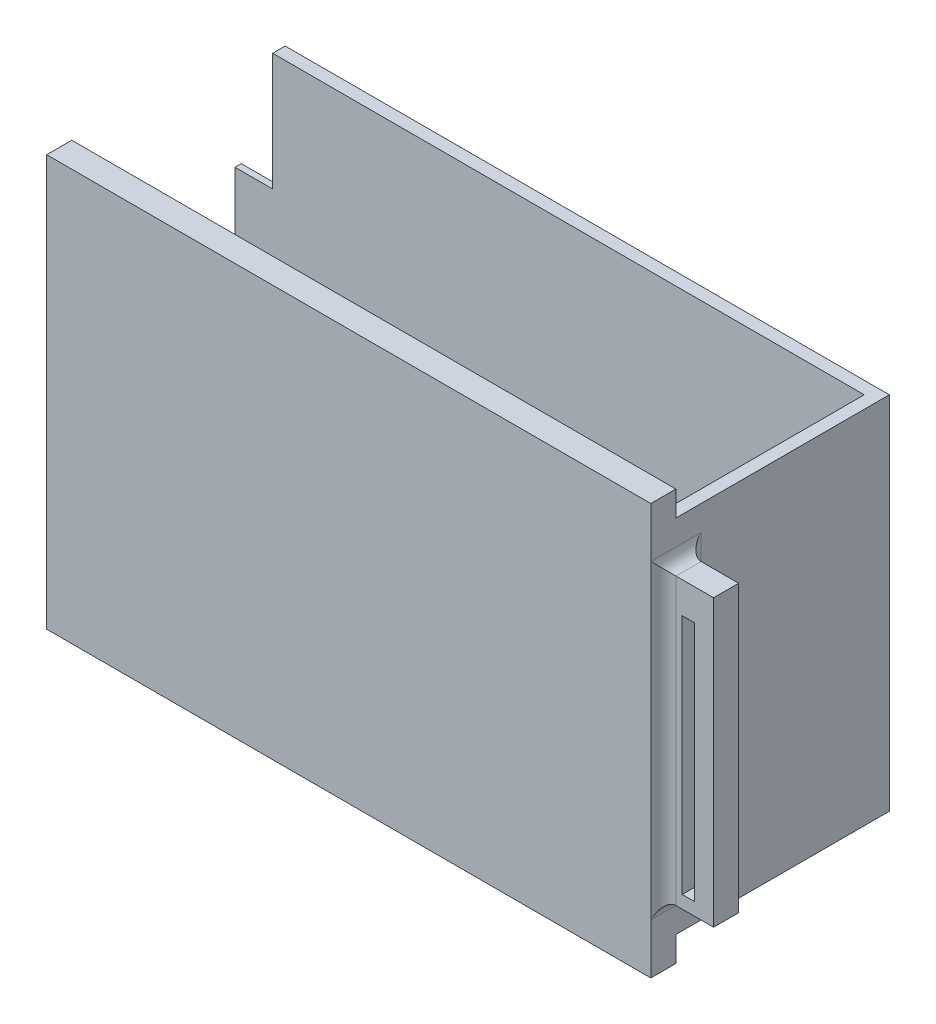
ISO-10303-21;
HEADER;
FILE_DESCRIPTION(('STEP AP214'),'2;1');
FILE_NAME('part.step','',(''),(''),'','','');
FILE_SCHEMA(('AUTOMOTIVE_DESIGN { 1 0 10303 214 1 1 1 1 }'));
ENDSEC;
DATA;
#1=APPLICATION_CONTEXT('core data for automotive mechanical design processes');
#2=APPLICATION_PROTOCOL_DEFINITION('international standard','automotive_design',2000,#1);
#3=PRODUCT_CONTEXT('',#1,'mechanical');
#4=PRODUCT('Part','Part','',(#3));
#5=PRODUCT_RELATED_PRODUCT_CATEGORY('part','',(#4));
#6=PRODUCT_DEFINITION_FORMATION('','',#4);
#7=PRODUCT_DEFINITION_CONTEXT('part definition',#1,'design');
#8=PRODUCT_DEFINITION('design','',#6,#7);
#9=PRODUCT_DEFINITION_SHAPE('','',#8);
#10=(LENGTH_UNIT() NAMED_UNIT(*) SI_UNIT(.MILLI.,.METRE.));
#11=(NAMED_UNIT(*) PLANE_ANGLE_UNIT() SI_UNIT($,.RADIAN.));
#12=(NAMED_UNIT(*) SI_UNIT($,.STERADIAN.) SOLID_ANGLE_UNIT());
#13=UNCERTAINTY_MEASURE_WITH_UNIT(LENGTH_MEASURE(1.E-05),#10,'distance_accuracy_value','');
#14=(GEOMETRIC_REPRESENTATION_CONTEXT(3) GLOBAL_UNCERTAINTY_ASSIGNED_CONTEXT((#13)) GLOBAL_UNIT_ASSIGNED_CONTEXT((#10,
#11,#12)) REPRESENTATION_CONTEXT('',''));
#15=CARTESIAN_POINT('',(0.,0.,0.));
#16=DIRECTION('',(0.,0.,1.));
#17=DIRECTION('',(1.,0.,0.));
#18=AXIS2_PLACEMENT_3D('',#15,#16,#17);
#19=CARTESIAN_POINT('',(1.,761.955360665247,1239.52069633304));
#20=DIRECTION('',(0.,0.,-1.));
#21=DIRECTION('',(-1.,0.,0.));
#22=AXIS2_PLACEMENT_3D('',#19,#20,#21);
#23=CYLINDRICAL_SURFACE('',#22,1.);
#24=DIRECTION('',(0.,0.,-1.));
#25=VECTOR('',#24,1.);
#26=CARTESIAN_POINT('',(1.,762.955360665247,1239.52069633304));
#27=LINE('',#26,#25);
#28=CARTESIAN_POINT('',(1.,762.955360665247,1239.52069633304));
#29=VERTEX_POINT('',#28);
#30=CARTESIAN_POINT('',(1.,762.955360665247,1237.52069633304));
#31=VERTEX_POINT('',#30);
#32=EDGE_CURVE('E388',#29,#31,#27,.T.);
#33=ORIENTED_EDGE('',*,*,#32,.F.);
#34=CARTESIAN_POINT('',(1.,761.955360665247,1240.52069633304));
#35=DIRECTION('',(0.,-0.707106781186547,-0.707106781186547));
#36=DIRECTION('',(0.,-0.707106781186547,0.707106781186547));
#37=AXIS2_PLACEMENT_3D('',#34,#35,#36);
#38=ELLIPSE('',#37,1.41421356237309,1.);
#39=CARTESIAN_POINT('',(0.,761.955360665247,1240.52069633304));
#40=VERTEX_POINT('',#39);
#41=EDGE_CURVE('E44',#29,#40,#38,.F.);
#42=ORIENTED_EDGE('',*,*,#41,.T.);
#43=DIRECTION('',(0.,0.,-1.));
#44=VECTOR('',#43,1.);
#45=CARTESIAN_POINT('',(0.,761.955360665247,0.));
#46=LINE('',#45,#44);
#47=CARTESIAN_POINT('',(0.,761.955360665247,1236.52069633304));
#48=VERTEX_POINT('',#47);
#49=EDGE_CURVE('E391',#48,#40,#46,.F.);
#50=ORIENTED_EDGE('',*,*,#49,.F.);
#51=CARTESIAN_POINT('',(1.,761.955360665247,1236.52069633304));
#52=DIRECTION('',(0.,0.707106781186547,-0.707106781186547));
#53=DIRECTION('',(0.,0.707106781186547,0.707106781186547));
#54=AXIS2_PLACEMENT_3D('',#51,#52,#53);
#55=ELLIPSE('',#54,1.41421356237309,1.);
#56=EDGE_CURVE('E11',#48,#31,#55,.T.);
#57=ORIENTED_EDGE('',*,*,#56,.T.);
#58=EDGE_LOOP('',(#33,#42,#50,#57));
#59=FACE_BOUND('',#58,.T.);
#60=ADVANCED_FACE('F37',(#59),#23,.F.);
#61=CARTESIAN_POINT('',(1.,786.685360665247,0.));
#62=DIRECTION('',(0.,0.,-1.));
#63=DIRECTION('',(-1.,0.,0.));
#64=AXIS2_PLACEMENT_3D('',#61,#62,#63);
#65=CYLINDRICAL_SURFACE('',#64,1.);
#66=DIRECTION('',(0.,0.,-1.));
#67=VECTOR('',#66,1.);
#68=CARTESIAN_POINT('',(0.,786.685360665247,0.));
#69=LINE('',#68,#67);
#70=CARTESIAN_POINT('',(0.,786.685360665247,1240.52069633304));
#71=VERTEX_POINT('',#70);
#72=CARTESIAN_POINT('',(0.,786.685360665247,1236.52069633304));
#73=VERTEX_POINT('',#72);
#74=EDGE_CURVE('E378',#71,#73,#69,.T.);
#75=ORIENTED_EDGE('',*,*,#74,.F.);
#76=CARTESIAN_POINT('',(1.,786.685360665247,1240.52069633304));
#77=DIRECTION('',(0.,-0.707106781186547,0.707106781186547));
#78=DIRECTION('',(0.,-0.707106781186547,-0.707106781186547));
#79=AXIS2_PLACEMENT_3D('',#76,#77,#78);
#80=ELLIPSE('',#79,1.41421356237309,1.);
#81=CARTESIAN_POINT('',(1.,785.685360665247,1239.52069633304));
#82=VERTEX_POINT('',#81);
#83=EDGE_CURVE('E383',#71,#82,#80,.T.);
#84=ORIENTED_EDGE('',*,*,#83,.T.);
#85=DIRECTION('',(0.,0.,-1.));
#86=VECTOR('',#85,1.);
#87=CARTESIAN_POINT('',(1.,785.685360665247,1239.52069633304));
#88=LINE('',#87,#86);
#89=CARTESIAN_POINT('',(1.,785.685360665247,1237.52069633304));
#90=VERTEX_POINT('',#89);
#91=EDGE_CURVE('E380',#90,#82,#88,.F.);
#92=ORIENTED_EDGE('',*,*,#91,.F.);
#93=CARTESIAN_POINT('',(1.,786.685360665247,1236.52069633304));
#94=DIRECTION('',(0.,0.707106781186547,0.707106781186547));
#95=DIRECTION('',(0.,0.707106781186547,-0.707106781186547));
#96=AXIS2_PLACEMENT_3D('',#93,#94,#95);
#97=ELLIPSE('',#96,1.41421356237309,1.);
#98=EDGE_CURVE('E385',#90,#73,#97,.F.);
#99=ORIENTED_EDGE('',*,*,#98,.T.);
#100=EDGE_LOOP('',(#75,#84,#92,#99));
#101=FACE_BOUND('',#100,.T.);
#102=ADVANCED_FACE('F452',(#101),#65,.F.);
#103=CARTESIAN_POINT('',(1.,785.685360665247,1236.52069633304));
#104=DIRECTION('',(0.,1.,0.));
#105=DIRECTION('',(0.,0.,1.));
#106=AXIS2_PLACEMENT_3D('',#103,#104,#105);
#107=CYLINDRICAL_SURFACE('',#106,1.);
#108=DIRECTION('',(0.,1.,0.));
#109=VECTOR('',#108,1.);
#110=CARTESIAN_POINT('',(1.,785.685360665247,1237.52069633304));
#111=LINE('',#110,#109);
#112=EDGE_CURVE('E374',#31,#90,#111,.T.);
#113=ORIENTED_EDGE('',*,*,#112,.F.);
#114=ORIENTED_EDGE('',*,*,#56,.F.);
#115=DIRECTION('',(0.,1.,0.));
#116=VECTOR('',#115,1.);
#117=CARTESIAN_POINT('',(0.,0.,1236.52069633304));
#118=LINE('',#117,#116);
#119=EDGE_CURVE('E51',#73,#48,#118,.F.);
#120=ORIENTED_EDGE('',*,*,#119,.F.);
#121=ORIENTED_EDGE('',*,*,#98,.F.);
#122=EDGE_LOOP('',(#113,#114,#120,#121));
#123=FACE_BOUND('',#122,.T.);
#124=ADVANCED_FACE('F457',(#123),#107,.F.);
#125=CARTESIAN_POINT('',(1.,785.685360665247,1240.52069633304));
#126=DIRECTION('',(0.,-1.,0.));
#127=DIRECTION('',(0.,0.,-1.));
#128=AXIS2_PLACEMENT_3D('',#125,#126,#127);
#129=CYLINDRICAL_SURFACE('',#128,1.);
#130=DIRECTION('',(0.,-1.,0.));
#131=VECTOR('',#130,1.);
#132=CARTESIAN_POINT('',(1.,785.685360665247,1239.52069633304));
#133=LINE('',#132,#131);
#134=EDGE_CURVE('E357',#82,#29,#133,.T.);
#135=ORIENTED_EDGE('',*,*,#134,.F.);
#136=ORIENTED_EDGE('',*,*,#83,.F.);
#137=DIRECTION('',(0.,-1.,0.));
#138=VECTOR('',#137,1.);
#139=CARTESIAN_POINT('',(0.,790.685360665247,1240.52069633304));
#140=LINE('',#139,#138);
#141=EDGE_CURVE('E59',#71,#40,#140,.T.);
#142=ORIENTED_EDGE('',*,*,#141,.T.);
#143=ORIENTED_EDGE('',*,*,#41,.F.);
#144=EDGE_LOOP('',(#135,#136,#142,#143));
#145=FACE_BOUND('',#144,.T.);
#146=ADVANCED_FACE('F462',(#145),#129,.F.);
#147=CARTESIAN_POINT('',(0.,0.,0.));
#148=DIRECTION('',(1.,0.,0.));
#149=DIRECTION('',(0.,0.,-1.));
#150=AXIS2_PLACEMENT_3D('',#147,#148,#149);
#151=PLANE('',#150);
#152=ORIENTED_EDGE('',*,*,#119,.T.);
#153=ORIENTED_EDGE('',*,*,#49,.T.);
#154=CARTESIAN_POINT('',(0.,757.955360665247,1240.52069633304));
#155=VERTEX_POINT('',#154);
#156=EDGE_CURVE('E308',#40,#155,#140,.T.);
#157=ORIENTED_EDGE('',*,*,#156,.T.);
#158=DIRECTION('',(0.,0.,-1.));
#159=VECTOR('',#158,1.);
#160=CARTESIAN_POINT('',(0.,757.955360665247,1240.52069633304));
#161=LINE('',#160,#159);
#162=CARTESIAN_POINT('',(0.,757.955360665247,1238.52069633304));
#163=VERTEX_POINT('',#162);
#164=EDGE_CURVE('E335',#155,#163,#161,.T.);
#165=ORIENTED_EDGE('',*,*,#164,.T.);
#166=DIRECTION('',(0.,1.,-2.22044604925031E-13));
#167=VECTOR('',#166,1.);
#168=CARTESIAN_POINT('',(0.,759.955360665247,1238.52069633304));
#169=LINE('',#168,#167);
#170=CARTESIAN_POINT('',(0.,759.955360665247,1238.52069633304));
#171=VERTEX_POINT('',#170);
#172=EDGE_CURVE('E338',#163,#171,#169,.T.);
#173=ORIENTED_EDGE('',*,*,#172,.T.);
#174=DIRECTION('',(0.,0.,-1.));
#175=VECTOR('',#174,1.);
#176=CARTESIAN_POINT('',(0.,759.955360665247,1238.52069633304));
#177=LINE('',#176,#175);
#178=CARTESIAN_POINT('',(0.,759.955360665247,1221.52069633304));
#179=VERTEX_POINT('',#178);
#180=EDGE_CURVE('E341',#171,#179,#177,.T.);
#181=ORIENTED_EDGE('',*,*,#180,.T.);
#182=DIRECTION('',(0.,1.,0.));
#183=VECTOR('',#182,1.);
#184=CARTESIAN_POINT('',(0.,788.685360665247,1221.52069633304));
#185=LINE('',#184,#183);
#186=CARTESIAN_POINT('',(0.,788.685360665247,1221.52069633304));
#187=VERTEX_POINT('',#186);
#188=EDGE_CURVE('E344',#179,#187,#185,.T.);
#189=ORIENTED_EDGE('',*,*,#188,.T.);
#190=DIRECTION('',(0.,0.,1.));
#191=VECTOR('',#190,1.);
#192=CARTESIAN_POINT('',(0.,788.685360665247,1238.52069633304));
#193=LINE('',#192,#191);
#194=CARTESIAN_POINT('',(0.,788.685360665247,1238.52069633304));
#195=VERTEX_POINT('',#194);
#196=EDGE_CURVE('E347',#187,#195,#193,.T.);
#197=ORIENTED_EDGE('',*,*,#196,.T.);
#198=DIRECTION('',(0.,1.,-3.33066907387547E-13));
#199=VECTOR('',#198,1.);
#200=CARTESIAN_POINT('',(0.,790.685360665247,1238.52069633304));
#201=LINE('',#200,#199);
#202=CARTESIAN_POINT('',(0.,790.685360665247,1238.52069633304));
#203=VERTEX_POINT('',#202);
#204=EDGE_CURVE('E350',#195,#203,#201,.T.);
#205=ORIENTED_EDGE('',*,*,#204,.T.);
#206=DIRECTION('',(0.,0.,1.));
#207=VECTOR('',#206,1.);
#208=CARTESIAN_POINT('',(0.,790.685360665247,1240.52069633304));
#209=LINE('',#208,#207);
#210=CARTESIAN_POINT('',(0.,790.685360665247,1240.52069633304));
#211=VERTEX_POINT('',#210);
#212=EDGE_CURVE('E315',#203,#211,#209,.T.);
#213=ORIENTED_EDGE('',*,*,#212,.T.);
#214=EDGE_CURVE('E332',#211,#71,#140,.T.);
#215=ORIENTED_EDGE('',*,*,#214,.T.);
#216=ORIENTED_EDGE('',*,*,#74,.T.);
#217=EDGE_LOOP('',(#152,#153,#157,#165,#173,#181,#189,#197,#205,#213,#215,#216));
#218=FACE_BOUND('',#217,.T.);
#219=ADVANCED_FACE('F397',(#218),#151,.T.);
#220=CARTESIAN_POINT('',(-48.12,0.,0.));
#221=DIRECTION('',(1.,0.,0.));
#222=DIRECTION('',(0.,0.,-1.));
#223=AXIS2_PLACEMENT_3D('',#220,#221,#222);
#224=PLANE('',#223);
#225=DIRECTION('',(0.,0.,1.));
#226=VECTOR('',#225,1.);
#227=CARTESIAN_POINT('',(-48.12,769.320360665247,1222.52069633304));
#228=LINE('',#227,#226);
#229=CARTESIAN_POINT('',(-48.12,769.320360665247,1222.02069633304));
#230=VERTEX_POINT('',#229);
#231=CARTESIAN_POINT('',(-48.12,769.320360665247,1222.52069633304));
#232=VERTEX_POINT('',#231);
#233=EDGE_CURVE('E265',#230,#232,#228,.T.);
#234=ORIENTED_EDGE('',*,*,#233,.F.);
#235=DIRECTION('',(0.,-1.,0.));
#236=VECTOR('',#235,1.);
#237=CARTESIAN_POINT('',(-48.12,779.320360665247,1222.02069633304));
#238=LINE('',#237,#236);
#239=CARTESIAN_POINT('',(-48.12,779.320360665247,1222.02069633304));
#240=VERTEX_POINT('',#239);
#241=EDGE_CURVE('E274',#240,#230,#238,.T.);
#242=ORIENTED_EDGE('',*,*,#241,.F.);
#243=DIRECTION('',(0.,0.,-1.));
#244=VECTOR('',#243,1.);
#245=CARTESIAN_POINT('',(-48.12,779.320360665247,1222.52069633304));
#246=LINE('',#245,#244);
#247=CARTESIAN_POINT('',(-48.12,779.320360665247,1222.52069633304));
#248=VERTEX_POINT('',#247);
#249=EDGE_CURVE('E260',#248,#240,#246,.T.);
#250=ORIENTED_EDGE('',*,*,#249,.F.);
#251=DIRECTION('',(0.,-1.,0.));
#252=VECTOR('',#251,1.);
#253=CARTESIAN_POINT('',(-48.12,788.685360665247,1222.52069633304));
#254=LINE('',#253,#252);
#255=CARTESIAN_POINT('',(-48.12,788.685360665247,1222.52069633304));
#256=VERTEX_POINT('',#255);
#257=EDGE_CURVE('E295',#256,#248,#254,.T.);
#258=ORIENTED_EDGE('',*,*,#257,.F.);
#259=DIRECTION('',(0.,0.,1.));
#260=VECTOR('',#259,1.);
#261=CARTESIAN_POINT('',(-48.12,788.685360665247,1238.52069633304));
#262=LINE('',#261,#260);
#263=CARTESIAN_POINT('',(-48.12,788.685360665247,1221.52069633304));
#264=VERTEX_POINT('',#263);
#265=EDGE_CURVE('E325',#264,#256,#262,.T.);
#266=ORIENTED_EDGE('',*,*,#265,.F.);
#267=DIRECTION('',(0.,1.,0.));
#268=VECTOR('',#267,1.);
#269=CARTESIAN_POINT('',(-48.12,788.685360665247,1221.52069633304));
#270=LINE('',#269,#268);
#271=CARTESIAN_POINT('',(-48.12,759.955360665247,1221.52069633304));
#272=VERTEX_POINT('',#271);
#273=EDGE_CURVE('E322',#272,#264,#270,.T.);
#274=ORIENTED_EDGE('',*,*,#273,.F.);
#275=DIRECTION('',(0.,0.,-1.));
#276=VECTOR('',#275,1.);
#277=CARTESIAN_POINT('',(-48.12,759.955360665247,1238.52069633304));
#278=LINE('',#277,#276);
#279=CARTESIAN_POINT('',(-48.12,759.955360665247,1222.52069633304));
#280=VERTEX_POINT('',#279);
#281=EDGE_CURVE('E320',#280,#272,#278,.T.);
#282=ORIENTED_EDGE('',*,*,#281,.F.);
#283=EDGE_CURVE('E290',#232,#280,#254,.T.);
#284=ORIENTED_EDGE('',*,*,#283,.F.);
#285=EDGE_LOOP('',(#234,#242,#250,#258,#266,#274,#282,#284));
#286=FACE_BOUND('',#285,.T.);
#287=ADVANCED_FACE('F439',(#286),#224,.F.);
#288=CARTESIAN_POINT('',(-48.12,790.685360665247,1240.52069633304));
#289=DIRECTION('',(0.,0.,1.));
#290=DIRECTION('',(1.,0.,0.));
#291=AXIS2_PLACEMENT_3D('',#288,#289,#290);
#292=PLANE('',#291);
#293=ORIENTED_EDGE('',*,*,#214,.F.);
#294=DIRECTION('',(1.,0.,0.));
#295=VECTOR('',#294,1.);
#296=CARTESIAN_POINT('',(-48.12,790.685360665247,1240.52069633304));
#297=LINE('',#296,#295);
#298=CARTESIAN_POINT('',(-48.12,790.685360665247,1240.52069633304));
#299=VERTEX_POINT('',#298);
#300=EDGE_CURVE('E355',#299,#211,#297,.T.);
#301=ORIENTED_EDGE('',*,*,#300,.F.);
#302=DIRECTION('',(0.,-1.,0.));
#303=VECTOR('',#302,1.);
#304=CARTESIAN_POINT('',(-48.12,790.685360665247,1240.52069633304));
#305=LINE('',#304,#303);
#306=CARTESIAN_POINT('',(-48.12,757.955360665247,1240.52069633304));
#307=VERTEX_POINT('',#306);
#308=EDGE_CURVE('E311',#299,#307,#305,.T.);
#309=ORIENTED_EDGE('',*,*,#308,.T.);
#310=DIRECTION('',(1.,0.,0.));
#311=VECTOR('',#310,1.);
#312=CARTESIAN_POINT('',(-48.12,757.955360665247,1240.52069633304));
#313=LINE('',#312,#311);
#314=EDGE_CURVE('E331',#307,#155,#313,.T.);
#315=ORIENTED_EDGE('',*,*,#314,.T.);
#316=ORIENTED_EDGE('',*,*,#156,.F.);
#317=ORIENTED_EDGE('',*,*,#141,.F.);
#318=EDGE_LOOP('',(#293,#301,#309,#315,#316,#317));
#319=FACE_BOUND('',#318,.T.);
#320=ADVANCED_FACE('F400',(#319),#292,.T.);
#321=CARTESIAN_POINT('',(-48.12,790.685360665247,1240.52069633304));
#322=DIRECTION('',(0.,1.,0.));
#323=DIRECTION('',(0.,0.,1.));
#324=AXIS2_PLACEMENT_3D('',#321,#322,#323);
#325=PLANE('',#324);
#326=ORIENTED_EDGE('',*,*,#212,.F.);
#327=DIRECTION('',(1.,0.,0.));
#328=VECTOR('',#327,1.);
#329=CARTESIAN_POINT('',(-48.12,790.685360665247,1238.52069633304));
#330=LINE('',#329,#328);
#331=CARTESIAN_POINT('',(-48.12,790.685360665247,1238.52069633304));
#332=VERTEX_POINT('',#331);
#333=EDGE_CURVE('E358',#332,#203,#330,.T.);
#334=ORIENTED_EDGE('',*,*,#333,.F.);
#335=DIRECTION('',(0.,0.,1.));
#336=VECTOR('',#335,1.);
#337=CARTESIAN_POINT('',(-48.12,790.685360665247,1240.52069633304));
#338=LINE('',#337,#336);
#339=EDGE_CURVE('E328',#332,#299,#338,.T.);
#340=ORIENTED_EDGE('',*,*,#339,.T.);
#341=ORIENTED_EDGE('',*,*,#300,.T.);
#342=EDGE_LOOP('',(#326,#334,#340,#341));
#343=FACE_BOUND('',#342,.T.);
#344=ADVANCED_FACE('F433',(#343),#325,.T.);
#345=CARTESIAN_POINT('',(-48.12,790.685360665247,1238.52069633304));
#346=DIRECTION('',(0.,-3.33066907387547E-13,-1.));
#347=DIRECTION('',(0.,1.,-3.33066907387547E-13));
#348=AXIS2_PLACEMENT_3D('',#345,#346,#347);
#349=PLANE('',#348);
#350=ORIENTED_EDGE('',*,*,#204,.F.);
#351=DIRECTION('',(1.,0.,0.));
#352=VECTOR('',#351,1.);
#353=CARTESIAN_POINT('',(-48.12,788.685360665247,1238.52069633304));
#354=LINE('',#353,#352);
#355=CARTESIAN_POINT('',(-0.999999999999994,788.685360665247,1238.52069633304));
#356=VERTEX_POINT('',#355);
#357=EDGE_CURVE('E360',#356,#195,#354,.T.);
#358=ORIENTED_EDGE('',*,*,#357,.F.);
#359=DIRECTION('',(0.,1.,0.));
#360=VECTOR('',#359,1.);
#361=CARTESIAN_POINT('',(-0.999999999999994,788.685360665247,1238.52069633304));
#362=LINE('',#361,#360);
#363=CARTESIAN_POINT('',(-0.999999999999994,759.955360665247,1238.52069633304));
#364=VERTEX_POINT('',#363);
#365=EDGE_CURVE('E298',#364,#356,#362,.T.);
#366=ORIENTED_EDGE('',*,*,#365,.F.);
#367=DIRECTION('',(1.,0.,0.));
#368=VECTOR('',#367,1.);
#369=CARTESIAN_POINT('',(-48.12,759.955360665247,1238.52069633304));
#370=LINE('',#369,#368);
#371=EDGE_CURVE('E366',#364,#171,#370,.T.);
#372=ORIENTED_EDGE('',*,*,#371,.T.);
#373=ORIENTED_EDGE('',*,*,#172,.F.);
#374=DIRECTION('',(1.,0.,0.));
#375=VECTOR('',#374,1.);
#376=CARTESIAN_POINT('',(-48.12,757.955360665247,1238.52069633304));
#377=LINE('',#376,#375);
#378=CARTESIAN_POINT('',(-48.12,757.955360665247,1238.52069633304));
#379=VERTEX_POINT('',#378);
#380=EDGE_CURVE('E368',#379,#163,#377,.T.);
#381=ORIENTED_EDGE('',*,*,#380,.F.);
#382=DIRECTION('',(0.,1.,-2.22044604925031E-13));
#383=VECTOR('',#382,1.);
#384=CARTESIAN_POINT('',(-48.12,759.955360665247,1238.52069633304));
#385=LINE('',#384,#383);
#386=EDGE_CURVE('E318',#379,#332,#385,.T.);
#387=ORIENTED_EDGE('',*,*,#386,.T.);
#388=ORIENTED_EDGE('',*,*,#333,.T.);
#389=EDGE_LOOP('',(#350,#358,#366,#372,#373,#381,#387,#388));
#390=FACE_BOUND('',#389,.T.);
#391=ADVANCED_FACE('F410',(#390),#349,.T.);
#392=CARTESIAN_POINT('',(-48.12,788.685360665247,1238.52069633304));
#393=DIRECTION('',(0.,1.,0.));
#394=DIRECTION('',(0.,0.,1.));
#395=AXIS2_PLACEMENT_3D('',#392,#393,#394);
#396=PLANE('',#395);
#397=DIRECTION('',(-1.,0.,0.));
#398=VECTOR('',#397,1.);
#399=CARTESIAN_POINT('',(-0.999999999999994,788.685360665247,1222.52069633304));
#400=LINE('',#399,#398);
#401=CARTESIAN_POINT('',(-0.999999999999994,788.685360665247,1222.52069633304));
#402=VERTEX_POINT('',#401);
#403=EDGE_CURVE('E306',#402,#256,#400,.T.);
#404=ORIENTED_EDGE('',*,*,#403,.F.);
#405=DIRECTION('',(0.,0.,-1.));
#406=VECTOR('',#405,1.);
#407=CARTESIAN_POINT('',(-0.999999999999994,788.685360665247,1222.52069633304));
#408=LINE('',#407,#406);
#409=EDGE_CURVE('E300',#356,#402,#408,.T.);
#410=ORIENTED_EDGE('',*,*,#409,.F.);
#411=ORIENTED_EDGE('',*,*,#357,.T.);
#412=ORIENTED_EDGE('',*,*,#196,.F.);
#413=DIRECTION('',(1.,0.,0.));
#414=VECTOR('',#413,1.);
#415=CARTESIAN_POINT('',(-48.12,788.685360665247,1221.52069633304));
#416=LINE('',#415,#414);
#417=EDGE_CURVE('E362',#264,#187,#416,.T.);
#418=ORIENTED_EDGE('',*,*,#417,.F.);
#419=ORIENTED_EDGE('',*,*,#265,.T.);
#420=EDGE_LOOP('',(#404,#410,#411,#412,#418,#419));
#421=FACE_BOUND('',#420,.T.);
#422=ADVANCED_FACE('F427',(#421),#396,.T.);
#423=CARTESIAN_POINT('',(-48.12,788.685360665247,1221.52069633304));
#424=DIRECTION('',(0.,0.,-1.));
#425=DIRECTION('',(-1.,0.,0.));
#426=AXIS2_PLACEMENT_3D('',#423,#424,#425);
#427=PLANE('',#426);
#428=ORIENTED_EDGE('',*,*,#188,.F.);
#429=DIRECTION('',(1.,0.,0.));
#430=VECTOR('',#429,1.);
#431=CARTESIAN_POINT('',(-48.12,759.955360665247,1221.52069633304));
#432=LINE('',#431,#430);
#433=EDGE_CURVE('E364',#272,#179,#432,.T.);
#434=ORIENTED_EDGE('',*,*,#433,.F.);
#435=ORIENTED_EDGE('',*,*,#273,.T.);
#436=ORIENTED_EDGE('',*,*,#417,.T.);
#437=EDGE_LOOP('',(#428,#434,#435,#436));
#438=FACE_BOUND('',#437,.T.);
#439=ADVANCED_FACE('F422',(#438),#427,.T.);
#440=CARTESIAN_POINT('',(-48.12,759.955360665247,1238.52069633304));
#441=DIRECTION('',(0.,-1.,0.));
#442=DIRECTION('',(0.,0.,-1.));
#443=AXIS2_PLACEMENT_3D('',#440,#441,#442);
#444=PLANE('',#443);
#445=DIRECTION('',(-1.,0.,0.));
#446=VECTOR('',#445,1.);
#447=CARTESIAN_POINT('',(-0.999999999999994,759.955360665247,1222.52069633304));
#448=LINE('',#447,#446);
#449=CARTESIAN_POINT('',(-0.999999999999994,759.955360665247,1222.52069633304));
#450=VERTEX_POINT('',#449);
#451=EDGE_CURVE('E303',#450,#280,#448,.T.);
#452=ORIENTED_EDGE('',*,*,#451,.T.);
#453=ORIENTED_EDGE('',*,*,#281,.T.);
#454=ORIENTED_EDGE('',*,*,#433,.T.);
#455=ORIENTED_EDGE('',*,*,#180,.F.);
#456=ORIENTED_EDGE('',*,*,#371,.F.);
#457=DIRECTION('',(0.,0.,1.));
#458=VECTOR('',#457,1.);
#459=CARTESIAN_POINT('',(-0.999999999999994,759.955360665247,1222.52069633304));
#460=LINE('',#459,#458);
#461=EDGE_CURVE('E294',#450,#364,#460,.T.);
#462=ORIENTED_EDGE('',*,*,#461,.F.);
#463=EDGE_LOOP('',(#452,#453,#454,#455,#456,#462));
#464=FACE_BOUND('',#463,.T.);
#465=ADVANCED_FACE('F416',(#464),#444,.T.);
#466=CARTESIAN_POINT('',(-48.12,757.955360665247,1240.52069633304));
#467=DIRECTION('',(0.,-1.,0.));
#468=DIRECTION('',(0.,0.,-1.));
#469=AXIS2_PLACEMENT_3D('',#466,#467,#468);
#470=PLANE('',#469);
#471=ORIENTED_EDGE('',*,*,#164,.F.);
#472=ORIENTED_EDGE('',*,*,#314,.F.);
#473=DIRECTION('',(0.,0.,-1.));
#474=VECTOR('',#473,1.);
#475=CARTESIAN_POINT('',(-48.12,757.955360665247,1240.52069633304));
#476=LINE('',#475,#474);
#477=EDGE_CURVE('E314',#307,#379,#476,.T.);
#478=ORIENTED_EDGE('',*,*,#477,.T.);
#479=ORIENTED_EDGE('',*,*,#380,.T.);
#480=EDGE_LOOP('',(#471,#472,#478,#479));
#481=FACE_BOUND('',#480,.T.);
#482=ADVANCED_FACE('F405',(#481),#470,.T.);
#483=ORIENTED_EDGE('',*,*,#339,.F.);
#484=ORIENTED_EDGE('',*,*,#386,.F.);
#485=ORIENTED_EDGE('',*,*,#477,.F.);
#486=ORIENTED_EDGE('',*,*,#308,.F.);
#487=EDGE_LOOP('',(#483,#484,#485,#486));
#488=FACE_BOUND('',#487,.T.);
#489=ADVANCED_FACE('F435',(#488),#224,.F.);
#490=CARTESIAN_POINT('',(-0.999999999999994,788.685360665247,1222.52069633304));
#491=DIRECTION('',(0.,0.,-1.));
#492=DIRECTION('',(-1.,0.,0.));
#493=AXIS2_PLACEMENT_3D('',#490,#491,#492);
#494=PLANE('',#493);
#495=ORIENTED_EDGE('',*,*,#257,.T.);
#496=DIRECTION('',(1.,0.,0.));
#497=VECTOR('',#496,1.);
#498=CARTESIAN_POINT('',(-51.12,779.320360665247,1222.52069633304));
#499=LINE('',#498,#497);
#500=CARTESIAN_POINT('',(-51.12,779.320360665247,1222.52069633304));
#501=VERTEX_POINT('',#500);
#502=EDGE_CURVE('E287',#501,#248,#499,.T.);
#503=ORIENTED_EDGE('',*,*,#502,.F.);
#504=DIRECTION('',(0.,1.,0.));
#505=VECTOR('',#504,1.);
#506=CARTESIAN_POINT('',(-51.12,779.320360665247,1222.52069633304));
#507=LINE('',#506,#505);
#508=CARTESIAN_POINT('',(-51.12,769.320360665247,1222.52069633304));
#509=VERTEX_POINT('',#508);
#510=EDGE_CURVE('E261',#509,#501,#507,.T.);
#511=ORIENTED_EDGE('',*,*,#510,.F.);
#512=DIRECTION('',(1.,0.,0.));
#513=VECTOR('',#512,1.);
#514=CARTESIAN_POINT('',(-51.12,769.320360665247,1222.52069633304));
#515=LINE('',#514,#513);
#516=EDGE_CURVE('E271',#509,#232,#515,.T.);
#517=ORIENTED_EDGE('',*,*,#516,.T.);
#518=ORIENTED_EDGE('',*,*,#283,.T.);
#519=ORIENTED_EDGE('',*,*,#451,.F.);
#520=DIRECTION('',(0.,-1.,0.));
#521=VECTOR('',#520,1.);
#522=CARTESIAN_POINT('',(-0.999999999999994,788.685360665247,1222.52069633304));
#523=LINE('',#522,#521);
#524=EDGE_CURVE('E291',#402,#450,#523,.T.);
#525=ORIENTED_EDGE('',*,*,#524,.F.);
#526=ORIENTED_EDGE('',*,*,#403,.T.);
#527=EDGE_LOOP('',(#495,#503,#511,#517,#518,#519,#525,#526));
#528=FACE_BOUND('',#527,.T.);
#529=ADVANCED_FACE('F437',(#528),#494,.F.);
#530=CARTESIAN_POINT('',(-0.999999999999994,0.,0.));
#531=DIRECTION('',(-1.,0.,0.));
#532=DIRECTION('',(0.,0.,1.));
#533=AXIS2_PLACEMENT_3D('',#530,#531,#532);
#534=PLANE('',#533);
#535=ORIENTED_EDGE('',*,*,#524,.T.);
#536=ORIENTED_EDGE('',*,*,#461,.T.);
#537=ORIENTED_EDGE('',*,*,#365,.T.);
#538=ORIENTED_EDGE('',*,*,#409,.T.);
#539=EDGE_LOOP('',(#535,#536,#537,#538));
#540=FACE_BOUND('',#539,.T.);
#541=ADVANCED_FACE('F444',(#540),#534,.T.);
#542=CARTESIAN_POINT('',(-51.12,779.320360665247,1222.52069633304));
#543=DIRECTION('',(0.,-1.,0.));
#544=DIRECTION('',(0.,0.,-1.));
#545=AXIS2_PLACEMENT_3D('',#542,#543,#544);
#546=PLANE('',#545);
#547=ORIENTED_EDGE('',*,*,#249,.T.);
#548=DIRECTION('',(1.,0.,0.));
#549=VECTOR('',#548,1.);
#550=CARTESIAN_POINT('',(-51.12,779.320360665247,1222.02069633304));
#551=LINE('',#550,#549);
#552=CARTESIAN_POINT('',(-51.12,779.320360665247,1222.02069633304));
#553=VERTEX_POINT('',#552);
#554=EDGE_CURVE('E284',#553,#240,#551,.T.);
#555=ORIENTED_EDGE('',*,*,#554,.F.);
#556=DIRECTION('',(0.,0.,-1.));
#557=VECTOR('',#556,1.);
#558=CARTESIAN_POINT('',(-51.12,779.320360665247,1222.52069633304));
#559=LINE('',#558,#557);
#560=EDGE_CURVE('E264',#501,#553,#559,.T.);
#561=ORIENTED_EDGE('',*,*,#560,.F.);
#562=ORIENTED_EDGE('',*,*,#502,.T.);
#563=EDGE_LOOP('',(#547,#555,#561,#562));
#564=FACE_BOUND('',#563,.T.);
#565=ADVANCED_FACE('F610',(#564),#546,.F.);
#566=CARTESIAN_POINT('',(-51.12,779.320360665247,1222.02069633304));
#567=DIRECTION('',(0.,0.,1.));
#568=DIRECTION('',(1.,0.,0.));
#569=AXIS2_PLACEMENT_3D('',#566,#567,#568);
#570=PLANE('',#569);
#571=ORIENTED_EDGE('',*,*,#241,.T.);
#572=DIRECTION('',(1.,0.,0.));
#573=VECTOR('',#572,1.);
#574=CARTESIAN_POINT('',(-51.12,769.320360665247,1222.02069633304));
#575=LINE('',#574,#573);
#576=CARTESIAN_POINT('',(-51.12,769.320360665247,1222.02069633304));
#577=VERTEX_POINT('',#576);
#578=EDGE_CURVE('E281',#577,#230,#575,.T.);
#579=ORIENTED_EDGE('',*,*,#578,.F.);
#580=DIRECTION('',(0.,-1.,0.));
#581=VECTOR('',#580,1.);
#582=CARTESIAN_POINT('',(-51.12,779.320360665247,1222.02069633304));
#583=LINE('',#582,#581);
#584=EDGE_CURVE('E267',#553,#577,#583,.T.);
#585=ORIENTED_EDGE('',*,*,#584,.F.);
#586=ORIENTED_EDGE('',*,*,#554,.T.);
#587=EDGE_LOOP('',(#571,#579,#585,#586));
#588=FACE_BOUND('',#587,.T.);
#589=ADVANCED_FACE('F599',(#588),#570,.F.);
#590=CARTESIAN_POINT('',(-51.12,769.320360665247,1222.52069633304));
#591=DIRECTION('',(0.,1.,0.));
#592=DIRECTION('',(0.,0.,1.));
#593=AXIS2_PLACEMENT_3D('',#590,#591,#592);
#594=PLANE('',#593);
#595=ORIENTED_EDGE('',*,*,#233,.T.);
#596=ORIENTED_EDGE('',*,*,#516,.F.);
#597=DIRECTION('',(0.,0.,1.));
#598=VECTOR('',#597,1.);
#599=CARTESIAN_POINT('',(-51.12,769.320360665247,1222.52069633304));
#600=LINE('',#599,#598);
#601=EDGE_CURVE('E269',#577,#509,#600,.T.);
#602=ORIENTED_EDGE('',*,*,#601,.F.);
#603=ORIENTED_EDGE('',*,*,#578,.T.);
#604=EDGE_LOOP('',(#595,#596,#602,#603));
#605=FACE_BOUND('',#604,.T.);
#606=ADVANCED_FACE('F588',(#605),#594,.F.);
#607=CARTESIAN_POINT('',(-51.12,0.,0.));
#608=DIRECTION('',(1.,0.,0.));
#609=DIRECTION('',(0.,0.,-1.));
#610=AXIS2_PLACEMENT_3D('',#607,#608,#609);
#611=PLANE('',#610);
#612=ORIENTED_EDGE('',*,*,#510,.T.);
#613=ORIENTED_EDGE('',*,*,#560,.T.);
#614=ORIENTED_EDGE('',*,*,#584,.T.);
#615=ORIENTED_EDGE('',*,*,#601,.T.);
#616=EDGE_LOOP('',(#612,#613,#614,#615));
#617=FACE_BOUND('',#616,.T.);
#618=ADVANCED_FACE('F574',(#617),#611,.F.);
#619=CARTESIAN_POINT('',(4.,785.685360665247,1239.52069633304));
#620=DIRECTION('',(0.,0.,-1.));
#621=DIRECTION('',(-1.,0.,0.));
#622=AXIS2_PLACEMENT_3D('',#619,#620,#621);
#623=PLANE('',#622);
#624=DIRECTION('',(1.,0.,0.));
#625=VECTOR('',#624,1.);
#626=CARTESIAN_POINT('',(1.5,763.967325273371,1239.52069633304));
#627=LINE('',#626,#625);
#628=CARTESIAN_POINT('',(1.5,763.967325273371,1239.52069633304));
#629=VERTEX_POINT('',#628);
#630=CARTESIAN_POINT('',(2.5,763.967325273371,1239.52069633304));
#631=VERTEX_POINT('',#630);
#632=EDGE_CURVE('E230',#629,#631,#627,.T.);
#633=ORIENTED_EDGE('',*,*,#632,.F.);
#634=DIRECTION('',(0.,-1.,0.));
#635=VECTOR('',#634,1.);
#636=CARTESIAN_POINT('',(1.5,783.197904077283,1239.52069633304));
#637=LINE('',#636,#635);
#638=CARTESIAN_POINT('',(1.5,783.197904077283,1239.52069633304));
#639=VERTEX_POINT('',#638);
#640=EDGE_CURVE('E204',#639,#629,#637,.T.);
#641=ORIENTED_EDGE('',*,*,#640,.F.);
#642=DIRECTION('',(-1.,0.,0.));
#643=VECTOR('',#642,1.);
#644=CARTESIAN_POINT('',(1.5,783.197904077283,1239.52069633304));
#645=LINE('',#644,#643);
#646=CARTESIAN_POINT('',(2.5,783.197904077283,1239.52069633304));
#647=VERTEX_POINT('',#646);
#648=EDGE_CURVE('E221',#647,#639,#645,.T.);
#649=ORIENTED_EDGE('',*,*,#648,.F.);
#650=DIRECTION('',(0.,1.,0.));
#651=VECTOR('',#650,1.);
#652=CARTESIAN_POINT('',(2.5,783.197904077283,1239.52069633304));
#653=LINE('',#652,#651);
#654=EDGE_CURVE('E224',#631,#647,#653,.T.);
#655=ORIENTED_EDGE('',*,*,#654,.F.);
#656=EDGE_LOOP('',(#633,#641,#649,#655));
#657=FACE_BOUND('',#656,.T.);
#658=DIRECTION('',(-1.,0.,0.));
#659=VECTOR('',#658,1.);
#660=CARTESIAN_POINT('',(4.,785.685360665247,1239.52069633304));
#661=LINE('',#660,#659);
#662=CARTESIAN_POINT('',(4.,785.685360665247,1239.52069633304));
#663=VERTEX_POINT('',#662);
#664=EDGE_CURVE('E248',#663,#82,#661,.T.);
#665=ORIENTED_EDGE('',*,*,#664,.T.);
#666=ORIENTED_EDGE('',*,*,#134,.T.);
#667=DIRECTION('',(-1.,0.,0.));
#668=VECTOR('',#667,1.);
#669=CARTESIAN_POINT('',(4.,762.955360665247,1239.52069633304));
#670=LINE('',#669,#668);
#671=CARTESIAN_POINT('',(4.,762.955360665247,1239.52069633304));
#672=VERTEX_POINT('',#671);
#673=EDGE_CURVE('E257',#672,#29,#670,.T.);
#674=ORIENTED_EDGE('',*,*,#673,.F.);
#675=DIRECTION('',(0.,-1.,0.));
#676=VECTOR('',#675,1.);
#677=CARTESIAN_POINT('',(4.,785.685360665247,1239.52069633304));
#678=LINE('',#677,#676);
#679=EDGE_CURVE('E236',#663,#672,#678,.T.);
#680=ORIENTED_EDGE('',*,*,#679,.F.);
#681=EDGE_LOOP('',(#665,#666,#674,#680));
#682=FACE_BOUND('',#681,.T.);
#683=ADVANCED_FACE('F501',(#657,#682),#623,.F.);
#684=CARTESIAN_POINT('',(4.,762.955360665247,1239.52069633304));
#685=DIRECTION('',(0.,1.,0.));
#686=DIRECTION('',(0.,0.,1.));
#687=AXIS2_PLACEMENT_3D('',#684,#685,#686);
#688=PLANE('',#687);
#689=ORIENTED_EDGE('',*,*,#673,.T.);
#690=ORIENTED_EDGE('',*,*,#32,.T.);
#691=DIRECTION('',(-1.,0.,0.));
#692=VECTOR('',#691,1.);
#693=CARTESIAN_POINT('',(4.,762.955360665247,1237.52069633304));
#694=LINE('',#693,#692);
#695=CARTESIAN_POINT('',(4.,762.955360665247,1237.52069633304));
#696=VERTEX_POINT('',#695);
#697=EDGE_CURVE('E254',#696,#31,#694,.T.);
#698=ORIENTED_EDGE('',*,*,#697,.F.);
#699=DIRECTION('',(0.,0.,-1.));
#700=VECTOR('',#699,1.);
#701=CARTESIAN_POINT('',(4.,762.955360665247,1239.52069633304));
#702=LINE('',#701,#700);
#703=EDGE_CURVE('E242',#672,#696,#702,.T.);
#704=ORIENTED_EDGE('',*,*,#703,.F.);
#705=EDGE_LOOP('',(#689,#690,#698,#704));
#706=FACE_BOUND('',#705,.T.);
#707=ADVANCED_FACE('F496',(#706),#688,.F.);
#708=CARTESIAN_POINT('',(4.,785.685360665247,1237.52069633304));
#709=DIRECTION('',(0.,0.,1.));
#710=DIRECTION('',(1.,0.,0.));
#711=AXIS2_PLACEMENT_3D('',#708,#709,#710);
#712=PLANE('',#711);
#713=ORIENTED_EDGE('',*,*,#697,.T.);
#714=ORIENTED_EDGE('',*,*,#112,.T.);
#715=DIRECTION('',(-1.,0.,0.));
#716=VECTOR('',#715,1.);
#717=CARTESIAN_POINT('',(4.,785.685360665247,1237.52069633304));
#718=LINE('',#717,#716);
#719=CARTESIAN_POINT('',(4.,785.685360665247,1237.52069633304));
#720=VERTEX_POINT('',#719);
#721=EDGE_CURVE('E251',#720,#90,#718,.T.);
#722=ORIENTED_EDGE('',*,*,#721,.F.);
#723=DIRECTION('',(0.,1.,0.));
#724=VECTOR('',#723,1.);
#725=CARTESIAN_POINT('',(4.,785.685360665247,1237.52069633304));
#726=LINE('',#725,#724);
#727=EDGE_CURVE('E244',#696,#720,#726,.T.);
#728=ORIENTED_EDGE('',*,*,#727,.F.);
#729=EDGE_LOOP('',(#713,#714,#722,#728));
#730=FACE_BOUND('',#729,.T.);
#731=ADVANCED_FACE('F500',(#730),#712,.F.);
#732=CARTESIAN_POINT('',(4.,785.685360665247,1239.52069633304));
#733=DIRECTION('',(0.,-1.,0.));
#734=DIRECTION('',(0.,0.,-1.));
#735=AXIS2_PLACEMENT_3D('',#732,#733,#734);
#736=PLANE('',#735);
#737=ORIENTED_EDGE('',*,*,#721,.T.);
#738=ORIENTED_EDGE('',*,*,#91,.T.);
#739=ORIENTED_EDGE('',*,*,#664,.F.);
#740=DIRECTION('',(0.,0.,1.));
#741=VECTOR('',#740,1.);
#742=CARTESIAN_POINT('',(4.,785.685360665247,1239.52069633304));
#743=LINE('',#742,#741);
#744=EDGE_CURVE('E246',#720,#663,#743,.T.);
#745=ORIENTED_EDGE('',*,*,#744,.F.);
#746=EDGE_LOOP('',(#737,#738,#739,#745));
#747=FACE_BOUND('',#746,.T.);
#748=ADVANCED_FACE('F517',(#747),#736,.F.);
#749=CARTESIAN_POINT('',(4.,0.,0.));
#750=DIRECTION('',(1.,0.,0.));
#751=DIRECTION('',(0.,0.,-1.));
#752=AXIS2_PLACEMENT_3D('',#749,#750,#751);
#753=PLANE('',#752);
#754=ORIENTED_EDGE('',*,*,#679,.T.);
#755=ORIENTED_EDGE('',*,*,#703,.T.);
#756=ORIENTED_EDGE('',*,*,#727,.T.);
#757=ORIENTED_EDGE('',*,*,#744,.T.);
#758=EDGE_LOOP('',(#754,#755,#756,#757));
#759=FACE_BOUND('',#758,.T.);
#760=ADVANCED_FACE('F524',(#759),#753,.T.);
#761=CARTESIAN_POINT('',(1.5,783.197904077283,1238.52069633304));
#762=DIRECTION('',(-1.,0.,0.));
#763=DIRECTION('',(0.,-1.,0.));
#764=AXIS2_PLACEMENT_3D('',#761,#762,#763);
#765=PLANE('',#764);
#766=ORIENTED_EDGE('',*,*,#640,.T.);
#767=DIRECTION('',(0.,0.,1.));
#768=VECTOR('',#767,1.);
#769=CARTESIAN_POINT('',(1.5,763.967325273371,1238.52069633304));
#770=LINE('',#769,#768);
#771=CARTESIAN_POINT('',(1.5,763.967325273371,1238.52069633304));
#772=VERTEX_POINT('',#771);
#773=EDGE_CURVE('E197',#772,#629,#770,.T.);
#774=ORIENTED_EDGE('',*,*,#773,.F.);
#775=DIRECTION('',(0.,-1.,0.));
#776=VECTOR('',#775,1.);
#777=CARTESIAN_POINT('',(1.5,783.197904077283,1238.52069633304));
#778=LINE('',#777,#776);
#779=CARTESIAN_POINT('',(1.5,783.197904077283,1238.52069633304));
#780=VERTEX_POINT('',#779);
#781=EDGE_CURVE('E201',#780,#772,#778,.T.);
#782=ORIENTED_EDGE('',*,*,#781,.F.);
#783=DIRECTION('',(0.,0.,1.));
#784=VECTOR('',#783,1.);
#785=CARTESIAN_POINT('',(1.5,783.197904077283,1238.52069633304));
#786=LINE('',#785,#784);
#787=EDGE_CURVE('E234',#780,#639,#786,.T.);
#788=ORIENTED_EDGE('',*,*,#787,.T.);
#789=EDGE_LOOP('',(#766,#774,#782,#788));
#790=FACE_BOUND('',#789,.T.);
#791=ADVANCED_FACE('F199',(#790),#765,.F.);
#792=CARTESIAN_POINT('',(1.5,783.197904077283,1238.52069633304));
#793=DIRECTION('',(0.,1.,0.));
#794=DIRECTION('',(0.,0.,1.));
#795=AXIS2_PLACEMENT_3D('',#792,#793,#794);
#796=PLANE('',#795);
#797=ORIENTED_EDGE('',*,*,#648,.T.);
#798=ORIENTED_EDGE('',*,*,#787,.F.);
#799=DIRECTION('',(-1.,0.,0.));
#800=VECTOR('',#799,1.);
#801=CARTESIAN_POINT('',(1.5,783.197904077283,1238.52069633304));
#802=LINE('',#801,#800);
#803=CARTESIAN_POINT('',(2.5,783.197904077283,1238.52069633304));
#804=VERTEX_POINT('',#803);
#805=EDGE_CURVE('E209',#804,#780,#802,.T.);
#806=ORIENTED_EDGE('',*,*,#805,.F.);
#807=DIRECTION('',(0.,0.,1.));
#808=VECTOR('',#807,1.);
#809=CARTESIAN_POINT('',(2.5,783.197904077283,1238.52069633304));
#810=LINE('',#809,#808);
#811=EDGE_CURVE('E237',#804,#647,#810,.T.);
#812=ORIENTED_EDGE('',*,*,#811,.T.);
#813=EDGE_LOOP('',(#797,#798,#806,#812));
#814=FACE_BOUND('',#813,.T.);
#815=ADVANCED_FACE('F540',(#814),#796,.F.);
#816=CARTESIAN_POINT('',(2.5,783.197904077283,1238.52069633304));
#817=DIRECTION('',(1.,0.,0.));
#818=DIRECTION('',(0.,1.,0.));
#819=AXIS2_PLACEMENT_3D('',#816,#817,#818);
#820=PLANE('',#819);
#821=ORIENTED_EDGE('',*,*,#654,.T.);
#822=ORIENTED_EDGE('',*,*,#811,.F.);
#823=DIRECTION('',(0.,1.,0.));
#824=VECTOR('',#823,1.);
#825=CARTESIAN_POINT('',(2.5,783.197904077283,1238.52069633304));
#826=LINE('',#825,#824);
#827=CARTESIAN_POINT('',(2.5,763.967325273371,1238.52069633304));
#828=VERTEX_POINT('',#827);
#829=EDGE_CURVE('E217',#828,#804,#826,.T.);
#830=ORIENTED_EDGE('',*,*,#829,.F.);
#831=DIRECTION('',(0.,0.,1.));
#832=VECTOR('',#831,1.);
#833=CARTESIAN_POINT('',(2.5,763.967325273371,1238.52069633304));
#834=LINE('',#833,#832);
#835=EDGE_CURVE('E208',#828,#631,#834,.T.);
#836=ORIENTED_EDGE('',*,*,#835,.T.);
#837=EDGE_LOOP('',(#821,#822,#830,#836));
#838=FACE_BOUND('',#837,.T.);
#839=ADVANCED_FACE('F547',(#838),#820,.F.);
#840=CARTESIAN_POINT('',(1.5,763.967325273371,1238.52069633304));
#841=DIRECTION('',(0.,-1.,0.));
#842=DIRECTION('',(0.,0.,-1.));
#843=AXIS2_PLACEMENT_3D('',#840,#841,#842);
#844=PLANE('',#843);
#845=ORIENTED_EDGE('',*,*,#632,.T.);
#846=ORIENTED_EDGE('',*,*,#835,.F.);
#847=DIRECTION('',(1.,0.,0.));
#848=VECTOR('',#847,1.);
#849=CARTESIAN_POINT('',(1.5,763.967325273371,1238.52069633304));
#850=LINE('',#849,#848);
#851=EDGE_CURVE('E212',#772,#828,#850,.T.);
#852=ORIENTED_EDGE('',*,*,#851,.F.);
#853=ORIENTED_EDGE('',*,*,#773,.T.);
#854=EDGE_LOOP('',(#845,#846,#852,#853));
#855=FACE_BOUND('',#854,.T.);
#856=ADVANCED_FACE('F213',(#855),#844,.F.);
#857=CARTESIAN_POINT('',(0.,0.,1238.52069633304));
#858=DIRECTION('',(0.,0.,1.));
#859=DIRECTION('',(1.,0.,0.));
#860=AXIS2_PLACEMENT_3D('',#857,#858,#859);
#861=PLANE('',#860);
#862=ORIENTED_EDGE('',*,*,#781,.T.);
#863=ORIENTED_EDGE('',*,*,#851,.T.);
#864=ORIENTED_EDGE('',*,*,#829,.T.);
#865=ORIENTED_EDGE('',*,*,#805,.T.);
#866=EDGE_LOOP('',(#862,#863,#864,#865));
#867=FACE_BOUND('',#866,.T.);
#868=ADVANCED_FACE('F219',(#867),#861,.T.);
#869=CLOSED_SHELL('',(#60,#102,#124,#146,#219,#287,#320,#344,#391,#422,#439,#465,#482,#489,#529,
#541,#565,#589,#606,#618,#683,#707,#731,#748,#760,#791,#815,#839,#856,#868));
#870=MANIFOLD_SOLID_BREP('B2',#869);
#871=ADVANCED_BREP_SHAPE_REPRESENTATION('',(#18,#870),#14);
#872=SHAPE_DEFINITION_REPRESENTATION(#9,#871);
ENDSEC;
END-ISO-10303-21;
